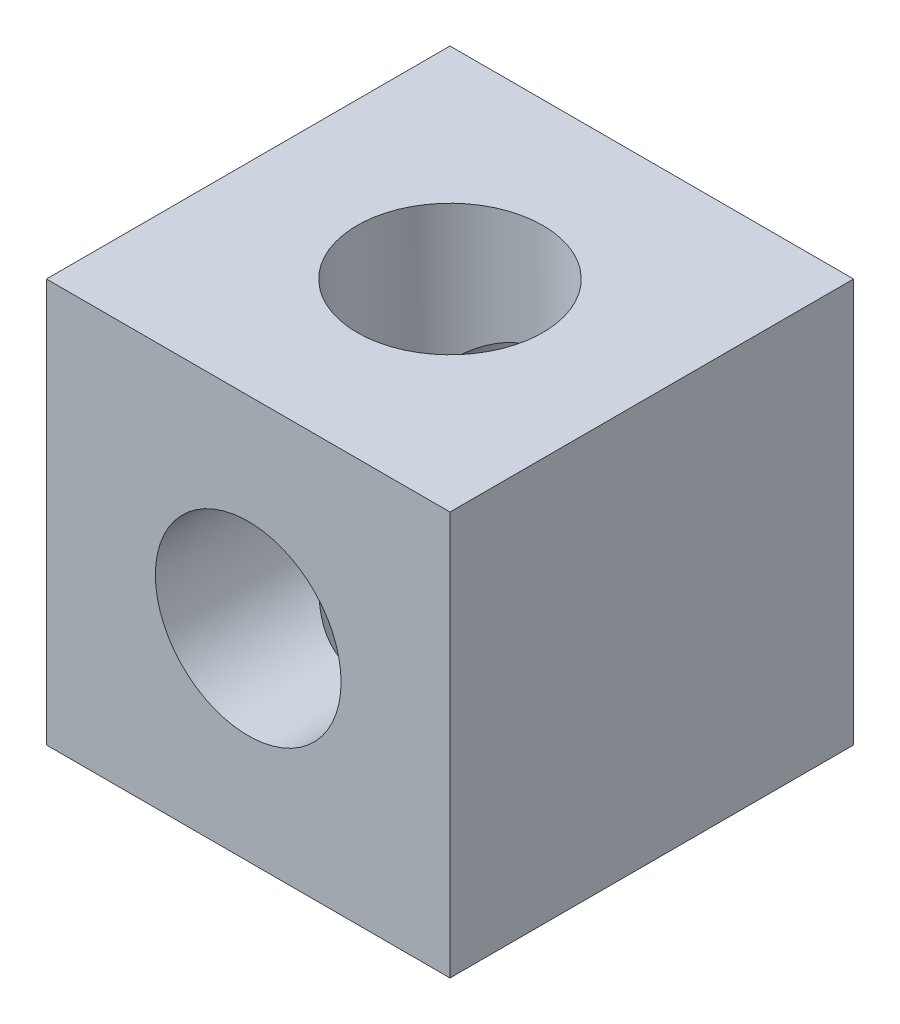
ISO-10303-21;
HEADER;
FILE_DESCRIPTION(('STEP AP214'),'2;1');
FILE_NAME('part.step','',(''),(''),'','','');
FILE_SCHEMA(('AUTOMOTIVE_DESIGN { 1 0 10303 214 1 1 1 1 }'));
ENDSEC;
DATA;
#1=APPLICATION_CONTEXT('core data for automotive mechanical design processes');
#2=APPLICATION_PROTOCOL_DEFINITION('international standard','automotive_design',2000,#1);
#3=PRODUCT_CONTEXT('',#1,'mechanical');
#4=PRODUCT('Part','Part','',(#3));
#5=PRODUCT_RELATED_PRODUCT_CATEGORY('part','',(#4));
#6=PRODUCT_DEFINITION_FORMATION('','',#4);
#7=PRODUCT_DEFINITION_CONTEXT('part definition',#1,'design');
#8=PRODUCT_DEFINITION('design','',#6,#7);
#9=PRODUCT_DEFINITION_SHAPE('','',#8);
#10=(LENGTH_UNIT() NAMED_UNIT(*) SI_UNIT(.MILLI.,.METRE.));
#11=(NAMED_UNIT(*) PLANE_ANGLE_UNIT() SI_UNIT($,.RADIAN.));
#12=(NAMED_UNIT(*) SI_UNIT($,.STERADIAN.) SOLID_ANGLE_UNIT());
#13=UNCERTAINTY_MEASURE_WITH_UNIT(LENGTH_MEASURE(1.E-05),#10,'distance_accuracy_value','');
#14=(GEOMETRIC_REPRESENTATION_CONTEXT(3) GLOBAL_UNCERTAINTY_ASSIGNED_CONTEXT((#13)) GLOBAL_UNIT_ASSIGNED_CONTEXT((#10,
#11,#12)) REPRESENTATION_CONTEXT('',''));
#15=CARTESIAN_POINT('',(0.,0.,0.));
#16=DIRECTION('',(0.,0.,1.));
#17=DIRECTION('',(1.,0.,0.));
#18=AXIS2_PLACEMENT_3D('',#15,#16,#17);
#19=CARTESIAN_POINT('',(0.,0.,-10.161));
#20=DIRECTION('',(0.,0.,1.));
#21=DIRECTION('',(1.,0.,0.));
#22=AXIS2_PLACEMENT_3D('',#19,#20,#21);
#23=CYLINDRICAL_SURFACE('',#22,4.675);
#24=CARTESIAN_POINT('',(0.,0.,10.16));
#25=DIRECTION('',(0.,0.,1.));
#26=DIRECTION('',(1.,0.,0.));
#27=AXIS2_PLACEMENT_3D('',#24,#25,#26);
#28=CIRCLE('',#27,4.675);
#29=CARTESIAN_POINT('',(4.675,0.,10.16));
#30=VERTEX_POINT('',#29);
#31=EDGE_CURVE('E156',#30,#30,#28,.T.);
#32=ORIENTED_EDGE('',*,*,#31,.T.);
#33=EDGE_LOOP('',(#32));
#34=FACE_BOUND('',#33,.T.);
#35=CARTESIAN_POINT('',(0.,0.,0.));
#36=DIRECTION('',(0.,-0.707106781186547,0.707106781186547));
#37=DIRECTION('',(0.,0.707106781186547,0.707106781186547));
#38=AXIS2_PLACEMENT_3D('',#35,#36,#37);
#39=ELLIPSE('',#38,6.61144840409422,4.675);
#40=CARTESIAN_POINT('',(-4.675,0.,0.));
#41=VERTEX_POINT('',#40);
#42=CARTESIAN_POINT('',(4.675,0.,0.));
#43=VERTEX_POINT('',#42);
#44=EDGE_CURVE('E59',#41,#43,#39,.F.);
#45=ORIENTED_EDGE('',*,*,#44,.T.);
#46=CARTESIAN_POINT('',(0.,0.,0.));
#47=DIRECTION('',(0.,0.707106781186547,0.707106781186547));
#48=DIRECTION('',(0.,-0.707106781186547,0.707106781186547));
#49=AXIS2_PLACEMENT_3D('',#46,#47,#48);
#50=ELLIPSE('',#49,6.61144840409422,4.675);
#51=EDGE_CURVE('E11',#43,#41,#50,.F.);
#52=ORIENTED_EDGE('',*,*,#51,.T.);
#53=EDGE_LOOP('',(#45,#52));
#54=FACE_BOUND('',#53,.T.);
#55=ADVANCED_FACE('F45',(#34,#54),#23,.F.);
#56=CARTESIAN_POINT('',(10.16,10.16,10.16));
#57=DIRECTION('',(-1.,0.,0.));
#58=DIRECTION('',(0.,0.,1.));
#59=AXIS2_PLACEMENT_3D('',#56,#57,#58);
#60=PLANE('',#59);
#61=DIRECTION('',(0.,0.,-1.));
#62=VECTOR('',#61,1.);
#63=CARTESIAN_POINT('',(10.16,-10.16,10.16));
#64=LINE('',#63,#62);
#65=CARTESIAN_POINT('',(10.16,-10.16,10.16));
#66=VERTEX_POINT('',#65);
#67=CARTESIAN_POINT('',(10.16,-10.16,-10.16));
#68=VERTEX_POINT('',#67);
#69=EDGE_CURVE('E139',#66,#68,#64,.T.);
#70=ORIENTED_EDGE('',*,*,#69,.T.);
#71=DIRECTION('',(0.,-1.,0.));
#72=VECTOR('',#71,1.);
#73=CARTESIAN_POINT('',(10.16,10.16,-10.16));
#74=LINE('',#73,#72);
#75=CARTESIAN_POINT('',(10.16,10.16,-10.16));
#76=VERTEX_POINT('',#75);
#77=EDGE_CURVE('E112',#76,#68,#74,.T.);
#78=ORIENTED_EDGE('',*,*,#77,.F.);
#79=DIRECTION('',(0.,0.,-1.));
#80=VECTOR('',#79,1.);
#81=CARTESIAN_POINT('',(10.16,10.16,10.16));
#82=LINE('',#81,#80);
#83=CARTESIAN_POINT('',(10.16,10.16,10.16));
#84=VERTEX_POINT('',#83);
#85=EDGE_CURVE('E132',#84,#76,#82,.T.);
#86=ORIENTED_EDGE('',*,*,#85,.F.);
#87=DIRECTION('',(0.,-1.,0.));
#88=VECTOR('',#87,1.);
#89=CARTESIAN_POINT('',(10.16,10.16,10.16));
#90=LINE('',#89,#88);
#91=EDGE_CURVE('E127',#84,#66,#90,.T.);
#92=ORIENTED_EDGE('',*,*,#91,.T.);
#93=EDGE_LOOP('',(#70,#78,#86,#92));
#94=FACE_BOUND('',#93,.T.);
#95=ADVANCED_FACE('F47',(#94),#60,.F.);
#96=CARTESIAN_POINT('',(-10.16,10.16,-10.16));
#97=DIRECTION('',(0.,0.,1.));
#98=DIRECTION('',(1.,0.,0.));
#99=AXIS2_PLACEMENT_3D('',#96,#97,#98);
#100=PLANE('',#99);
#101=CARTESIAN_POINT('',(0.,0.,-10.16));
#102=DIRECTION('',(0.,0.,1.));
#103=DIRECTION('',(1.,0.,0.));
#104=AXIS2_PLACEMENT_3D('',#101,#102,#103);
#105=CIRCLE('',#104,4.675);
#106=CARTESIAN_POINT('',(4.675,0.,-10.16));
#107=VERTEX_POINT('',#106);
#108=EDGE_CURVE('E143',#107,#107,#105,.F.);
#109=ORIENTED_EDGE('',*,*,#108,.F.);
#110=EDGE_LOOP('',(#109));
#111=FACE_BOUND('',#110,.T.);
#112=DIRECTION('',(-1.,0.,0.));
#113=VECTOR('',#112,1.);
#114=CARTESIAN_POINT('',(-10.16,-10.16,-10.16));
#115=LINE('',#114,#113);
#116=CARTESIAN_POINT('',(-10.16,-10.16,-10.16));
#117=VERTEX_POINT('',#116);
#118=EDGE_CURVE('E136',#68,#117,#115,.T.);
#119=ORIENTED_EDGE('',*,*,#118,.T.);
#120=DIRECTION('',(0.,-1.,0.));
#121=VECTOR('',#120,1.);
#122=CARTESIAN_POINT('',(-10.16,10.16,-10.16));
#123=LINE('',#122,#121);
#124=CARTESIAN_POINT('',(-10.16,10.16,-10.16));
#125=VERTEX_POINT('',#124);
#126=EDGE_CURVE('E120',#125,#117,#123,.T.);
#127=ORIENTED_EDGE('',*,*,#126,.F.);
#128=DIRECTION('',(-1.,0.,0.));
#129=VECTOR('',#128,1.);
#130=CARTESIAN_POINT('',(-10.16,10.16,-10.16));
#131=LINE('',#130,#129);
#132=EDGE_CURVE('E97',#76,#125,#131,.T.);
#133=ORIENTED_EDGE('',*,*,#132,.F.);
#134=ORIENTED_EDGE('',*,*,#77,.T.);
#135=EDGE_LOOP('',(#119,#127,#133,#134));
#136=FACE_BOUND('',#135,.T.);
#137=ADVANCED_FACE('F184',(#111,#136),#100,.F.);
#138=CARTESIAN_POINT('',(-10.16,10.16,10.16));
#139=DIRECTION('',(1.,0.,0.));
#140=DIRECTION('',(0.,0.,-1.));
#141=AXIS2_PLACEMENT_3D('',#138,#139,#140);
#142=PLANE('',#141);
#143=DIRECTION('',(0.,0.,1.));
#144=VECTOR('',#143,1.);
#145=CARTESIAN_POINT('',(-10.16,-10.16,10.16));
#146=LINE('',#145,#144);
#147=CARTESIAN_POINT('',(-10.16,-10.16,10.16));
#148=VERTEX_POINT('',#147);
#149=EDGE_CURVE('E133',#117,#148,#146,.T.);
#150=ORIENTED_EDGE('',*,*,#149,.T.);
#151=DIRECTION('',(0.,-1.,0.));
#152=VECTOR('',#151,1.);
#153=CARTESIAN_POINT('',(-10.16,10.16,10.16));
#154=LINE('',#153,#152);
#155=CARTESIAN_POINT('',(-10.16,10.16,10.16));
#156=VERTEX_POINT('',#155);
#157=EDGE_CURVE('E124',#156,#148,#154,.T.);
#158=ORIENTED_EDGE('',*,*,#157,.F.);
#159=DIRECTION('',(0.,0.,1.));
#160=VECTOR('',#159,1.);
#161=CARTESIAN_POINT('',(-10.16,10.16,10.16));
#162=LINE('',#161,#160);
#163=EDGE_CURVE('E146',#125,#156,#162,.T.);
#164=ORIENTED_EDGE('',*,*,#163,.F.);
#165=ORIENTED_EDGE('',*,*,#126,.T.);
#166=EDGE_LOOP('',(#150,#158,#164,#165));
#167=FACE_BOUND('',#166,.T.);
#168=ADVANCED_FACE('F201',(#167),#142,.F.);
#169=CARTESIAN_POINT('',(-10.16,10.16,10.16));
#170=DIRECTION('',(0.,0.,-1.));
#171=DIRECTION('',(-1.,0.,0.));
#172=AXIS2_PLACEMENT_3D('',#169,#170,#171);
#173=PLANE('',#172);
#174=ORIENTED_EDGE('',*,*,#31,.F.);
#175=EDGE_LOOP('',(#174));
#176=FACE_BOUND('',#175,.T.);
#177=DIRECTION('',(1.,0.,0.));
#178=VECTOR('',#177,1.);
#179=CARTESIAN_POINT('',(-10.16,-10.16,10.16));
#180=LINE('',#179,#178);
#181=EDGE_CURVE('E89',#148,#66,#180,.T.);
#182=ORIENTED_EDGE('',*,*,#181,.T.);
#183=ORIENTED_EDGE('',*,*,#91,.F.);
#184=DIRECTION('',(1.,0.,0.));
#185=VECTOR('',#184,1.);
#186=CARTESIAN_POINT('',(-10.16,10.16,10.16));
#187=LINE('',#186,#185);
#188=EDGE_CURVE('E68',#156,#84,#187,.T.);
#189=ORIENTED_EDGE('',*,*,#188,.F.);
#190=ORIENTED_EDGE('',*,*,#157,.T.);
#191=EDGE_LOOP('',(#182,#183,#189,#190));
#192=FACE_BOUND('',#191,.T.);
#193=ADVANCED_FACE('F196',(#176,#192),#173,.F.);
#194=CARTESIAN_POINT('',(0.,10.16,0.));
#195=DIRECTION('',(0.,-1.,0.));
#196=DIRECTION('',(0.,0.,-1.));
#197=AXIS2_PLACEMENT_3D('',#194,#195,#196);
#198=PLANE('',#197);
#199=CARTESIAN_POINT('',(0.,10.16,0.));
#200=DIRECTION('',(0.,1.,0.));
#201=DIRECTION('',(0.,0.,1.));
#202=AXIS2_PLACEMENT_3D('',#199,#200,#201);
#203=CIRCLE('',#202,4.675);
#204=CARTESIAN_POINT('',(0.,10.16,4.675));
#205=VERTEX_POINT('',#204);
#206=EDGE_CURVE('E161',#205,#205,#203,.T.);
#207=ORIENTED_EDGE('',*,*,#206,.F.);
#208=EDGE_LOOP('',(#207));
#209=FACE_BOUND('',#208,.T.);
#210=ORIENTED_EDGE('',*,*,#85,.T.);
#211=ORIENTED_EDGE('',*,*,#132,.T.);
#212=ORIENTED_EDGE('',*,*,#163,.T.);
#213=ORIENTED_EDGE('',*,*,#188,.T.);
#214=EDGE_LOOP('',(#210,#211,#212,#213));
#215=FACE_BOUND('',#214,.T.);
#216=ADVANCED_FACE('F191',(#209,#215),#198,.F.);
#217=CARTESIAN_POINT('',(0.,-10.16,0.));
#218=DIRECTION('',(0.,-1.,0.));
#219=DIRECTION('',(0.,0.,-1.));
#220=AXIS2_PLACEMENT_3D('',#217,#218,#219);
#221=PLANE('',#220);
#222=CARTESIAN_POINT('',(0.,-10.16,0.));
#223=DIRECTION('',(0.,1.,0.));
#224=DIRECTION('',(0.,0.,1.));
#225=AXIS2_PLACEMENT_3D('',#222,#223,#224);
#226=CIRCLE('',#225,4.675);
#227=CARTESIAN_POINT('',(0.,-10.16,4.675));
#228=VERTEX_POINT('',#227);
#229=EDGE_CURVE('E160',#228,#228,#226,.T.);
#230=ORIENTED_EDGE('',*,*,#229,.T.);
#231=EDGE_LOOP('',(#230));
#232=FACE_BOUND('',#231,.T.);
#233=ORIENTED_EDGE('',*,*,#69,.F.);
#234=ORIENTED_EDGE('',*,*,#181,.F.);
#235=ORIENTED_EDGE('',*,*,#149,.F.);
#236=ORIENTED_EDGE('',*,*,#118,.F.);
#237=EDGE_LOOP('',(#233,#234,#235,#236));
#238=FACE_BOUND('',#237,.T.);
#239=ADVANCED_FACE('F169',(#232,#238),#221,.T.);
#240=CARTESIAN_POINT('',(0.,0.,0.));
#241=DIRECTION('',(0.,-0.707106781186547,0.707106781186547));
#242=DIRECTION('',(0.,0.707106781186547,0.707106781186547));
#243=AXIS2_PLACEMENT_3D('',#240,#241,#242);
#244=ELLIPSE('',#243,6.61144840409422,4.675);
#245=EDGE_CURVE('E103',#41,#43,#244,.T.);
#246=ORIENTED_EDGE('',*,*,#245,.T.);
#247=CARTESIAN_POINT('',(0.,0.,0.));
#248=DIRECTION('',(0.,0.707106781186547,0.707106781186547));
#249=DIRECTION('',(0.,-0.707106781186547,0.707106781186547));
#250=AXIS2_PLACEMENT_3D('',#247,#248,#249);
#251=ELLIPSE('',#250,6.61144840409422,4.675);
#252=EDGE_CURVE('E54',#43,#41,#251,.T.);
#253=ORIENTED_EDGE('',*,*,#252,.T.);
#254=EDGE_LOOP('',(#246,#253));
#255=FACE_BOUND('',#254,.T.);
#256=ORIENTED_EDGE('',*,*,#108,.T.);
#257=EDGE_LOOP('',(#256));
#258=FACE_BOUND('',#257,.T.);
#259=ADVANCED_FACE('F114',(#255,#258),#23,.F.);
#260=CARTESIAN_POINT('',(0.,-10.16,0.));
#261=DIRECTION('',(0.,1.,0.));
#262=DIRECTION('',(0.,0.,1.));
#263=AXIS2_PLACEMENT_3D('',#260,#261,#262);
#264=CYLINDRICAL_SURFACE('',#263,4.675);
#265=ORIENTED_EDGE('',*,*,#206,.T.);
#266=EDGE_LOOP('',(#265));
#267=FACE_BOUND('',#266,.T.);
#268=ORIENTED_EDGE('',*,*,#44,.F.);
#269=ORIENTED_EDGE('',*,*,#252,.F.);
#270=EDGE_LOOP('',(#268,#269));
#271=FACE_BOUND('',#270,.T.);
#272=ADVANCED_FACE('F110',(#267,#271),#264,.F.);
#273=ORIENTED_EDGE('',*,*,#229,.F.);
#274=EDGE_LOOP('',(#273));
#275=FACE_BOUND('',#274,.T.);
#276=ORIENTED_EDGE('',*,*,#245,.F.);
#277=ORIENTED_EDGE('',*,*,#51,.F.);
#278=EDGE_LOOP('',(#276,#277));
#279=FACE_BOUND('',#278,.T.);
#280=ADVANCED_FACE('F104',(#275,#279),#264,.F.);
#281=CLOSED_SHELL('',(#55,#95,#137,#168,#193,#216,#239,#259,#272,#280));
#282=MANIFOLD_SOLID_BREP('B2',#281);
#283=ADVANCED_BREP_SHAPE_REPRESENTATION('',(#18,#282),#14);
#284=SHAPE_DEFINITION_REPRESENTATION(#9,#283);
ENDSEC;
END-ISO-10303-21;
